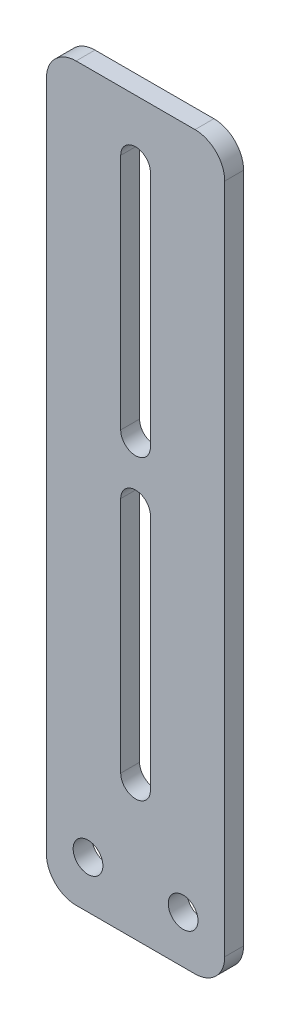
ISO-10303-21;
HEADER;
FILE_DESCRIPTION(('STEP AP214'),'2;1');
FILE_NAME('part.step','',(''),(''),'','','');
FILE_SCHEMA(('AUTOMOTIVE_DESIGN { 1 0 10303 214 1 1 1 1 }'));
ENDSEC;
DATA;
#1=APPLICATION_CONTEXT('core data for automotive mechanical design processes');
#2=APPLICATION_PROTOCOL_DEFINITION('international standard','automotive_design',2000,#1);
#3=PRODUCT_CONTEXT('',#1,'mechanical');
#4=PRODUCT('Part','Part','',(#3));
#5=PRODUCT_RELATED_PRODUCT_CATEGORY('part','',(#4));
#6=PRODUCT_DEFINITION_FORMATION('','',#4);
#7=PRODUCT_DEFINITION_CONTEXT('part definition',#1,'design');
#8=PRODUCT_DEFINITION('design','',#6,#7);
#9=PRODUCT_DEFINITION_SHAPE('','',#8);
#10=(LENGTH_UNIT() NAMED_UNIT(*) SI_UNIT(.MILLI.,.METRE.));
#11=(NAMED_UNIT(*) PLANE_ANGLE_UNIT() SI_UNIT($,.RADIAN.));
#12=(NAMED_UNIT(*) SI_UNIT($,.STERADIAN.) SOLID_ANGLE_UNIT());
#13=UNCERTAINTY_MEASURE_WITH_UNIT(LENGTH_MEASURE(1.E-05),#10,'distance_accuracy_value','');
#14=(GEOMETRIC_REPRESENTATION_CONTEXT(3) GLOBAL_UNCERTAINTY_ASSIGNED_CONTEXT((#13)) GLOBAL_UNIT_ASSIGNED_CONTEXT((#10,
#11,#12)) REPRESENTATION_CONTEXT('',''));
#15=CARTESIAN_POINT('',(0.,0.,0.));
#16=DIRECTION('',(0.,0.,1.));
#17=DIRECTION('',(1.,0.,0.));
#18=AXIS2_PLACEMENT_3D('',#15,#16,#17);
#19=CARTESIAN_POINT('',(0.,0.,3.175));
#20=DIRECTION('',(0.,0.,1.));
#21=DIRECTION('',(1.,0.,0.));
#22=AXIS2_PLACEMENT_3D('',#19,#20,#21);
#23=PLANE('',#22);
#24=CARTESIAN_POINT('',(8.,8.00000000000001,3.175));
#25=DIRECTION('',(0.,0.,1.));
#26=DIRECTION('',(-1.,0.,0.));
#27=AXIS2_PLACEMENT_3D('',#24,#25,#26);
#28=CIRCLE('',#27,2.5);
#29=CARTESIAN_POINT('',(5.5,8.00000000000001,3.175));
#30=VERTEX_POINT('',#29);
#31=EDGE_CURVE('E183',#30,#30,#28,.T.);
#32=ORIENTED_EDGE('',*,*,#31,.F.);
#33=EDGE_LOOP('',(#32));
#34=FACE_BOUND('',#33,.T.);
#35=DIRECTION('',(1.,0.,0.));
#36=VECTOR('',#35,1.);
#37=CARTESIAN_POINT('',(-15.,0.,3.175));
#38=LINE('',#37,#36);
#39=CARTESIAN_POINT('',(-9.99999999999998,0.,3.175));
#40=VERTEX_POINT('',#39);
#41=CARTESIAN_POINT('',(10.,0.,3.175));
#42=VERTEX_POINT('',#41);
#43=EDGE_CURVE('E230',#40,#42,#38,.T.);
#44=ORIENTED_EDGE('',*,*,#43,.T.);
#45=CARTESIAN_POINT('',(10.,5.,3.175));
#46=DIRECTION('',(0.,0.,1.));
#47=DIRECTION('',(1.,0.,0.));
#48=AXIS2_PLACEMENT_3D('',#45,#46,#47);
#49=CIRCLE('',#48,5.);
#50=CARTESIAN_POINT('',(15.,5.,3.175));
#51=VERTEX_POINT('',#50);
#52=EDGE_CURVE('E268',#42,#51,#49,.T.);
#53=ORIENTED_EDGE('',*,*,#52,.T.);
#54=DIRECTION('',(0.,1.,0.));
#55=VECTOR('',#54,1.);
#56=CARTESIAN_POINT('',(15.,0.,3.175));
#57=LINE('',#56,#55);
#58=CARTESIAN_POINT('',(15.,118.,3.175));
#59=VERTEX_POINT('',#58);
#60=EDGE_CURVE('E233',#51,#59,#57,.T.);
#61=ORIENTED_EDGE('',*,*,#60,.T.);
#62=CARTESIAN_POINT('',(10.,118.,3.175));
#63=DIRECTION('',(0.,0.,1.));
#64=DIRECTION('',(1.,0.,0.));
#65=AXIS2_PLACEMENT_3D('',#62,#63,#64);
#66=CIRCLE('',#65,5.);
#67=CARTESIAN_POINT('',(10.,123.,3.175));
#68=VERTEX_POINT('',#67);
#69=EDGE_CURVE('E264',#59,#68,#66,.T.);
#70=ORIENTED_EDGE('',*,*,#69,.T.);
#71=DIRECTION('',(-1.,0.,0.));
#72=VECTOR('',#71,1.);
#73=CARTESIAN_POINT('',(-15.,123.,3.175));
#74=LINE('',#73,#72);
#75=CARTESIAN_POINT('',(-10.,123.,3.175));
#76=VERTEX_POINT('',#75);
#77=EDGE_CURVE('E225',#68,#76,#74,.T.);
#78=ORIENTED_EDGE('',*,*,#77,.T.);
#79=CARTESIAN_POINT('',(-10.,118.,3.175));
#80=DIRECTION('',(0.,0.,1.));
#81=DIRECTION('',(1.,0.,0.));
#82=AXIS2_PLACEMENT_3D('',#79,#80,#81);
#83=CIRCLE('',#82,5.);
#84=CARTESIAN_POINT('',(-15.,118.,3.175));
#85=VERTEX_POINT('',#84);
#86=EDGE_CURVE('E56',#76,#85,#83,.T.);
#87=ORIENTED_EDGE('',*,*,#86,.T.);
#88=DIRECTION('',(0.,-1.,0.));
#89=VECTOR('',#88,1.);
#90=CARTESIAN_POINT('',(-15.,123.,3.175));
#91=LINE('',#90,#89);
#92=CARTESIAN_POINT('',(-15.,5.,3.175));
#93=VERTEX_POINT('',#92);
#94=EDGE_CURVE('E227',#85,#93,#91,.T.);
#95=ORIENTED_EDGE('',*,*,#94,.T.);
#96=CARTESIAN_POINT('',(-9.99999999999998,5.,3.175));
#97=DIRECTION('',(0.,0.,1.));
#98=DIRECTION('',(1.,0.,0.));
#99=AXIS2_PLACEMENT_3D('',#96,#97,#98);
#100=CIRCLE('',#99,5.);
#101=EDGE_CURVE('E266',#93,#40,#100,.T.);
#102=ORIENTED_EDGE('',*,*,#101,.T.);
#103=EDGE_LOOP('',(#44,#53,#61,#70,#78,#87,#95,#102));
#104=FACE_BOUND('',#103,.T.);
#105=DIRECTION('',(0.,-1.,0.));
#106=VECTOR('',#105,1.);
#107=CARTESIAN_POINT('',(-2.50000000000001,113.,3.175));
#108=LINE('',#107,#106);
#109=CARTESIAN_POINT('',(-2.50000000000001,113.,3.175));
#110=VERTEX_POINT('',#109);
#111=CARTESIAN_POINT('',(-2.50000000000002,73.,3.175));
#112=VERTEX_POINT('',#111);
#113=EDGE_CURVE('E196',#110,#112,#108,.T.);
#114=ORIENTED_EDGE('',*,*,#113,.F.);
#115=CARTESIAN_POINT('',(0.,113.,3.175));
#116=DIRECTION('',(0.,0.,1.));
#117=DIRECTION('',(1.,0.,0.));
#118=AXIS2_PLACEMENT_3D('',#115,#116,#117);
#119=CIRCLE('',#118,2.5);
#120=CARTESIAN_POINT('',(2.49999999999999,113.,3.175));
#121=VERTEX_POINT('',#120);
#122=EDGE_CURVE('E194',#121,#110,#119,.T.);
#123=ORIENTED_EDGE('',*,*,#122,.F.);
#124=DIRECTION('',(0.,1.,0.));
#125=VECTOR('',#124,1.);
#126=CARTESIAN_POINT('',(2.49999999999999,113.,3.175));
#127=LINE('',#126,#125);
#128=CARTESIAN_POINT('',(2.49999999999998,73.,3.175));
#129=VERTEX_POINT('',#128);
#130=EDGE_CURVE('E202',#129,#121,#127,.T.);
#131=ORIENTED_EDGE('',*,*,#130,.F.);
#132=CARTESIAN_POINT('',(0.,73.,3.175));
#133=DIRECTION('',(0.,0.,1.));
#134=DIRECTION('',(1.,0.,0.));
#135=AXIS2_PLACEMENT_3D('',#132,#133,#134);
#136=CIRCLE('',#135,2.5);
#137=EDGE_CURVE('E199',#112,#129,#136,.T.);
#138=ORIENTED_EDGE('',*,*,#137,.F.);
#139=EDGE_LOOP('',(#114,#123,#131,#138));
#140=FACE_BOUND('',#139,.T.);
#141=DIRECTION('',(0.,1.,0.));
#142=VECTOR('',#141,1.);
#143=CARTESIAN_POINT('',(2.49999999999998,63.,3.175));
#144=LINE('',#143,#142);
#145=CARTESIAN_POINT('',(2.49999999999998,23.,3.175));
#146=VERTEX_POINT('',#145);
#147=CARTESIAN_POINT('',(2.49999999999998,63.,3.175));
#148=VERTEX_POINT('',#147);
#149=EDGE_CURVE('E160',#146,#148,#144,.T.);
#150=ORIENTED_EDGE('',*,*,#149,.F.);
#151=CARTESIAN_POINT('',(0.,23.,3.175));
#152=DIRECTION('',(0.,0.,1.));
#153=DIRECTION('',(1.,0.,0.));
#154=AXIS2_PLACEMENT_3D('',#151,#152,#153);
#155=CIRCLE('',#154,2.5);
#156=CARTESIAN_POINT('',(-2.50000000000001,23.,3.175));
#157=VERTEX_POINT('',#156);
#158=EDGE_CURVE('E150',#157,#146,#155,.T.);
#159=ORIENTED_EDGE('',*,*,#158,.F.);
#160=DIRECTION('',(0.,-1.,0.));
#161=VECTOR('',#160,1.);
#162=CARTESIAN_POINT('',(-2.50000000000002,63.,3.175));
#163=LINE('',#162,#161);
#164=CARTESIAN_POINT('',(-2.50000000000002,63.,3.175));
#165=VERTEX_POINT('',#164);
#166=EDGE_CURVE('E176',#165,#157,#163,.T.);
#167=ORIENTED_EDGE('',*,*,#166,.F.);
#168=CARTESIAN_POINT('',(0.,63.,3.175));
#169=DIRECTION('',(0.,0.,1.));
#170=DIRECTION('',(-1.,0.,0.));
#171=AXIS2_PLACEMENT_3D('',#168,#169,#170);
#172=CIRCLE('',#171,2.5);
#173=EDGE_CURVE('E174',#148,#165,#172,.T.);
#174=ORIENTED_EDGE('',*,*,#173,.F.);
#175=EDGE_LOOP('',(#150,#159,#167,#174));
#176=FACE_BOUND('',#175,.T.);
#177=CARTESIAN_POINT('',(-8.,8.00000000000001,3.175));
#178=DIRECTION('',(0.,0.,1.));
#179=DIRECTION('',(1.,0.,0.));
#180=AXIS2_PLACEMENT_3D('',#177,#178,#179);
#181=CIRCLE('',#180,2.5);
#182=CARTESIAN_POINT('',(-5.5,8.00000000000001,3.175));
#183=VERTEX_POINT('',#182);
#184=EDGE_CURVE('E506',#183,#183,#181,.T.);
#185=ORIENTED_EDGE('',*,*,#184,.F.);
#186=EDGE_LOOP('',(#185));
#187=FACE_BOUND('',#186,.T.);
#188=ADVANCED_FACE('F34',(#34,#104,#140,#176,#187),#23,.T.);
#189=CARTESIAN_POINT('',(0.,0.,0.));
#190=DIRECTION('',(0.,0.,1.));
#191=DIRECTION('',(1.,0.,0.));
#192=AXIS2_PLACEMENT_3D('',#189,#190,#191);
#193=PLANE('',#192);
#194=CARTESIAN_POINT('',(0.,113.,0.));
#195=DIRECTION('',(0.,0.,1.));
#196=DIRECTION('',(1.,0.,0.));
#197=AXIS2_PLACEMENT_3D('',#194,#195,#196);
#198=CIRCLE('',#197,2.5);
#199=CARTESIAN_POINT('',(2.49999999999999,113.,0.));
#200=VERTEX_POINT('',#199);
#201=CARTESIAN_POINT('',(-2.50000000000001,113.,0.));
#202=VERTEX_POINT('',#201);
#203=EDGE_CURVE('E168',#200,#202,#198,.T.);
#204=ORIENTED_EDGE('',*,*,#203,.T.);
#205=DIRECTION('',(0.,-1.,0.));
#206=VECTOR('',#205,1.);
#207=CARTESIAN_POINT('',(-2.50000000000001,113.,0.));
#208=LINE('',#207,#206);
#209=CARTESIAN_POINT('',(-2.50000000000002,73.,0.));
#210=VERTEX_POINT('',#209);
#211=EDGE_CURVE('E207',#202,#210,#208,.T.);
#212=ORIENTED_EDGE('',*,*,#211,.T.);
#213=CARTESIAN_POINT('',(0.,73.,0.));
#214=DIRECTION('',(0.,0.,1.));
#215=DIRECTION('',(1.,0.,0.));
#216=AXIS2_PLACEMENT_3D('',#213,#214,#215);
#217=CIRCLE('',#216,2.5);
#218=CARTESIAN_POINT('',(2.49999999999998,73.,0.));
#219=VERTEX_POINT('',#218);
#220=EDGE_CURVE('E210',#210,#219,#217,.T.);
#221=ORIENTED_EDGE('',*,*,#220,.T.);
#222=DIRECTION('',(0.,1.,0.));
#223=VECTOR('',#222,1.);
#224=CARTESIAN_POINT('',(2.49999999999999,113.,0.));
#225=LINE('',#224,#223);
#226=EDGE_CURVE('E197',#219,#200,#225,.T.);
#227=ORIENTED_EDGE('',*,*,#226,.T.);
#228=EDGE_LOOP('',(#204,#212,#221,#227));
#229=FACE_BOUND('',#228,.T.);
#230=DIRECTION('',(0.,1.,0.));
#231=VECTOR('',#230,1.);
#232=CARTESIAN_POINT('',(15.,0.,0.));
#233=LINE('',#232,#231);
#234=CARTESIAN_POINT('',(15.,5.,0.));
#235=VERTEX_POINT('',#234);
#236=CARTESIAN_POINT('',(15.,118.,0.));
#237=VERTEX_POINT('',#236);
#238=EDGE_CURVE('E228',#235,#237,#233,.T.);
#239=ORIENTED_EDGE('',*,*,#238,.F.);
#240=CARTESIAN_POINT('',(10.,5.,0.));
#241=DIRECTION('',(0.,0.,1.));
#242=DIRECTION('',(1.,0.,0.));
#243=AXIS2_PLACEMENT_3D('',#240,#241,#242);
#244=CIRCLE('',#243,5.);
#245=CARTESIAN_POINT('',(10.,0.,0.));
#246=VERTEX_POINT('',#245);
#247=EDGE_CURVE('E256',#235,#246,#244,.F.);
#248=ORIENTED_EDGE('',*,*,#247,.T.);
#249=DIRECTION('',(1.,0.,0.));
#250=VECTOR('',#249,1.);
#251=CARTESIAN_POINT('',(-15.,0.,0.));
#252=LINE('',#251,#250);
#253=CARTESIAN_POINT('',(-9.99999999999998,0.,0.));
#254=VERTEX_POINT('',#253);
#255=EDGE_CURVE('E241',#254,#246,#252,.T.);
#256=ORIENTED_EDGE('',*,*,#255,.F.);
#257=CARTESIAN_POINT('',(-9.99999999999998,5.,0.));
#258=DIRECTION('',(0.,0.,1.));
#259=DIRECTION('',(1.,0.,0.));
#260=AXIS2_PLACEMENT_3D('',#257,#258,#259);
#261=CIRCLE('',#260,5.);
#262=CARTESIAN_POINT('',(-15.,5.,0.));
#263=VERTEX_POINT('',#262);
#264=EDGE_CURVE('E254',#254,#263,#261,.F.);
#265=ORIENTED_EDGE('',*,*,#264,.T.);
#266=DIRECTION('',(0.,-1.,0.));
#267=VECTOR('',#266,1.);
#268=CARTESIAN_POINT('',(-15.,123.,0.));
#269=LINE('',#268,#267);
#270=CARTESIAN_POINT('',(-15.,118.,0.));
#271=VERTEX_POINT('',#270);
#272=EDGE_CURVE('E239',#271,#263,#269,.T.);
#273=ORIENTED_EDGE('',*,*,#272,.F.);
#274=CARTESIAN_POINT('',(-10.,118.,0.));
#275=DIRECTION('',(0.,0.,1.));
#276=DIRECTION('',(1.,0.,0.));
#277=AXIS2_PLACEMENT_3D('',#274,#275,#276);
#278=CIRCLE('',#277,5.);
#279=CARTESIAN_POINT('',(-10.,123.,0.));
#280=VERTEX_POINT('',#279);
#281=EDGE_CURVE('E250',#271,#280,#278,.F.);
#282=ORIENTED_EDGE('',*,*,#281,.T.);
#283=DIRECTION('',(-1.,0.,0.));
#284=VECTOR('',#283,1.);
#285=CARTESIAN_POINT('',(-15.,123.,0.));
#286=LINE('',#285,#284);
#287=CARTESIAN_POINT('',(10.,123.,0.));
#288=VERTEX_POINT('',#287);
#289=EDGE_CURVE('E224',#288,#280,#286,.T.);
#290=ORIENTED_EDGE('',*,*,#289,.F.);
#291=CARTESIAN_POINT('',(10.,118.,0.));
#292=DIRECTION('',(0.,0.,1.));
#293=DIRECTION('',(1.,0.,0.));
#294=AXIS2_PLACEMENT_3D('',#291,#292,#293);
#295=CIRCLE('',#294,5.);
#296=EDGE_CURVE('E252',#288,#237,#295,.F.);
#297=ORIENTED_EDGE('',*,*,#296,.T.);
#298=EDGE_LOOP('',(#239,#248,#256,#265,#273,#282,#290,#297));
#299=FACE_BOUND('',#298,.T.);
#300=CARTESIAN_POINT('',(0.,23.,0.));
#301=DIRECTION('',(0.,0.,1.));
#302=DIRECTION('',(1.,0.,0.));
#303=AXIS2_PLACEMENT_3D('',#300,#301,#302);
#304=CIRCLE('',#303,2.5);
#305=CARTESIAN_POINT('',(-2.50000000000001,23.,0.));
#306=VERTEX_POINT('',#305);
#307=CARTESIAN_POINT('',(2.49999999999998,23.,0.));
#308=VERTEX_POINT('',#307);
#309=EDGE_CURVE('E181',#306,#308,#304,.T.);
#310=ORIENTED_EDGE('',*,*,#309,.T.);
#311=DIRECTION('',(0.,1.,0.));
#312=VECTOR('',#311,1.);
#313=CARTESIAN_POINT('',(2.49999999999998,63.,0.));
#314=LINE('',#313,#312);
#315=CARTESIAN_POINT('',(2.49999999999998,63.,0.));
#316=VERTEX_POINT('',#315);
#317=EDGE_CURVE('E167',#308,#316,#314,.T.);
#318=ORIENTED_EDGE('',*,*,#317,.T.);
#319=CARTESIAN_POINT('',(0.,63.,0.));
#320=DIRECTION('',(0.,0.,1.));
#321=DIRECTION('',(-1.,0.,0.));
#322=AXIS2_PLACEMENT_3D('',#319,#320,#321);
#323=CIRCLE('',#322,2.5);
#324=CARTESIAN_POINT('',(-2.50000000000002,63.,0.));
#325=VERTEX_POINT('',#324);
#326=EDGE_CURVE('E185',#316,#325,#323,.T.);
#327=ORIENTED_EDGE('',*,*,#326,.T.);
#328=DIRECTION('',(0.,-1.,0.));
#329=VECTOR('',#328,1.);
#330=CARTESIAN_POINT('',(-2.50000000000002,63.,0.));
#331=LINE('',#330,#329);
#332=EDGE_CURVE('E161',#325,#306,#331,.T.);
#333=ORIENTED_EDGE('',*,*,#332,.T.);
#334=EDGE_LOOP('',(#310,#318,#327,#333));
#335=FACE_BOUND('',#334,.T.);
#336=CARTESIAN_POINT('',(8.,8.00000000000001,0.));
#337=DIRECTION('',(0.,0.,1.));
#338=DIRECTION('',(-1.,0.,0.));
#339=AXIS2_PLACEMENT_3D('',#336,#337,#338);
#340=CIRCLE('',#339,2.5);
#341=CARTESIAN_POINT('',(5.5,8.00000000000001,0.));
#342=VERTEX_POINT('',#341);
#343=EDGE_CURVE('E502',#342,#342,#340,.T.);
#344=ORIENTED_EDGE('',*,*,#343,.T.);
#345=EDGE_LOOP('',(#344));
#346=FACE_BOUND('',#345,.T.);
#347=CARTESIAN_POINT('',(-8.,8.00000000000001,0.));
#348=DIRECTION('',(0.,0.,1.));
#349=DIRECTION('',(1.,0.,0.));
#350=AXIS2_PLACEMENT_3D('',#347,#348,#349);
#351=CIRCLE('',#350,2.5);
#352=CARTESIAN_POINT('',(-5.5,8.00000000000001,0.));
#353=VERTEX_POINT('',#352);
#354=EDGE_CURVE('E505',#353,#353,#351,.T.);
#355=ORIENTED_EDGE('',*,*,#354,.T.);
#356=EDGE_LOOP('',(#355));
#357=FACE_BOUND('',#356,.T.);
#358=ADVANCED_FACE('F287',(#229,#299,#335,#346,#357),#193,.F.);
#359=CARTESIAN_POINT('',(-15.,123.,3.175));
#360=DIRECTION('',(0.,-1.,0.));
#361=DIRECTION('',(0.,0.,-1.));
#362=AXIS2_PLACEMENT_3D('',#359,#360,#361);
#363=PLANE('',#362);
#364=ORIENTED_EDGE('',*,*,#77,.F.);
#365=DIRECTION('',(0.,0.,-1.));
#366=VECTOR('',#365,1.);
#367=CARTESIAN_POINT('',(10.,123.,3.175));
#368=LINE('',#367,#366);
#369=EDGE_CURVE('E11',#68,#288,#368,.T.);
#370=ORIENTED_EDGE('',*,*,#369,.T.);
#371=ORIENTED_EDGE('',*,*,#289,.T.);
#372=DIRECTION('',(0.,0.,-1.));
#373=VECTOR('',#372,1.);
#374=CARTESIAN_POINT('',(-10.,123.,3.175));
#375=LINE('',#374,#373);
#376=EDGE_CURVE('E42',#280,#76,#375,.F.);
#377=ORIENTED_EDGE('',*,*,#376,.T.);
#378=EDGE_LOOP('',(#364,#370,#371,#377));
#379=FACE_BOUND('',#378,.T.);
#380=ADVANCED_FACE('F276',(#379),#363,.F.);
#381=CARTESIAN_POINT('',(-15.,123.,3.175));
#382=DIRECTION('',(1.,0.,0.));
#383=DIRECTION('',(0.,1.,0.));
#384=AXIS2_PLACEMENT_3D('',#381,#382,#383);
#385=PLANE('',#384);
#386=ORIENTED_EDGE('',*,*,#272,.T.);
#387=DIRECTION('',(0.,0.,-1.));
#388=VECTOR('',#387,1.);
#389=CARTESIAN_POINT('',(-15.,5.,3.175));
#390=LINE('',#389,#388);
#391=EDGE_CURVE('E49',#263,#93,#390,.F.);
#392=ORIENTED_EDGE('',*,*,#391,.T.);
#393=ORIENTED_EDGE('',*,*,#94,.F.);
#394=DIRECTION('',(0.,0.,-1.));
#395=VECTOR('',#394,1.);
#396=CARTESIAN_POINT('',(-15.,118.,3.175));
#397=LINE('',#396,#395);
#398=EDGE_CURVE('E270',#85,#271,#397,.T.);
#399=ORIENTED_EDGE('',*,*,#398,.T.);
#400=EDGE_LOOP('',(#386,#392,#393,#399));
#401=FACE_BOUND('',#400,.T.);
#402=ADVANCED_FACE('F284',(#401),#385,.F.);
#403=CARTESIAN_POINT('',(-15.,0.,3.175));
#404=DIRECTION('',(0.,1.,0.));
#405=DIRECTION('',(-1.,0.,0.));
#406=AXIS2_PLACEMENT_3D('',#403,#404,#405);
#407=PLANE('',#406);
#408=ORIENTED_EDGE('',*,*,#255,.T.);
#409=DIRECTION('',(0.,0.,-1.));
#410=VECTOR('',#409,1.);
#411=CARTESIAN_POINT('',(10.,0.,3.175));
#412=LINE('',#411,#410);
#413=EDGE_CURVE('E261',#246,#42,#412,.F.);
#414=ORIENTED_EDGE('',*,*,#413,.T.);
#415=ORIENTED_EDGE('',*,*,#43,.F.);
#416=DIRECTION('',(0.,0.,-1.));
#417=VECTOR('',#416,1.);
#418=CARTESIAN_POINT('',(-9.99999999999998,0.,3.175));
#419=LINE('',#418,#417);
#420=EDGE_CURVE('E258',#40,#254,#419,.T.);
#421=ORIENTED_EDGE('',*,*,#420,.T.);
#422=EDGE_LOOP('',(#408,#414,#415,#421));
#423=FACE_BOUND('',#422,.T.);
#424=ADVANCED_FACE('F296',(#423),#407,.F.);
#425=CARTESIAN_POINT('',(15.,0.,3.175));
#426=DIRECTION('',(-1.,0.,0.));
#427=DIRECTION('',(0.,-1.,0.));
#428=AXIS2_PLACEMENT_3D('',#425,#426,#427);
#429=PLANE('',#428);
#430=ORIENTED_EDGE('',*,*,#60,.F.);
#431=DIRECTION('',(0.,0.,-1.));
#432=VECTOR('',#431,1.);
#433=CARTESIAN_POINT('',(15.,5.,3.175));
#434=LINE('',#433,#432);
#435=EDGE_CURVE('E247',#51,#235,#434,.T.);
#436=ORIENTED_EDGE('',*,*,#435,.T.);
#437=ORIENTED_EDGE('',*,*,#238,.T.);
#438=DIRECTION('',(0.,0.,-1.));
#439=VECTOR('',#438,1.);
#440=CARTESIAN_POINT('',(15.,118.,3.175));
#441=LINE('',#440,#439);
#442=EDGE_CURVE('E236',#237,#59,#441,.F.);
#443=ORIENTED_EDGE('',*,*,#442,.T.);
#444=EDGE_LOOP('',(#430,#436,#437,#443));
#445=FACE_BOUND('',#444,.T.);
#446=ADVANCED_FACE('F304',(#445),#429,.F.);
#447=CARTESIAN_POINT('',(0.,113.,3.175));
#448=DIRECTION('',(0.,0.,-1.));
#449=DIRECTION('',(-1.,0.,0.));
#450=AXIS2_PLACEMENT_3D('',#447,#448,#449);
#451=CYLINDRICAL_SURFACE('',#450,2.5);
#452=ORIENTED_EDGE('',*,*,#203,.F.);
#453=DIRECTION('',(0.,0.,-1.));
#454=VECTOR('',#453,1.);
#455=CARTESIAN_POINT('',(2.49999999999999,113.,3.175));
#456=LINE('',#455,#454);
#457=EDGE_CURVE('E204',#121,#200,#456,.T.);
#458=ORIENTED_EDGE('',*,*,#457,.F.);
#459=ORIENTED_EDGE('',*,*,#122,.T.);
#460=DIRECTION('',(0.,0.,-1.));
#461=VECTOR('',#460,1.);
#462=CARTESIAN_POINT('',(-2.50000000000001,113.,3.175));
#463=LINE('',#462,#461);
#464=EDGE_CURVE('E221',#110,#202,#463,.T.);
#465=ORIENTED_EDGE('',*,*,#464,.T.);
#466=EDGE_LOOP('',(#452,#458,#459,#465));
#467=FACE_BOUND('',#466,.T.);
#468=ADVANCED_FACE('F324',(#467),#451,.F.);
#469=CARTESIAN_POINT('',(-2.50000000000001,113.,3.175));
#470=DIRECTION('',(1.,0.,0.));
#471=DIRECTION('',(0.,1.,0.));
#472=AXIS2_PLACEMENT_3D('',#469,#470,#471);
#473=PLANE('',#472);
#474=ORIENTED_EDGE('',*,*,#211,.F.);
#475=ORIENTED_EDGE('',*,*,#464,.F.);
#476=ORIENTED_EDGE('',*,*,#113,.T.);
#477=DIRECTION('',(0.,0.,-1.));
#478=VECTOR('',#477,1.);
#479=CARTESIAN_POINT('',(-2.50000000000002,73.,3.175));
#480=LINE('',#479,#478);
#481=EDGE_CURVE('E219',#112,#210,#480,.T.);
#482=ORIENTED_EDGE('',*,*,#481,.T.);
#483=EDGE_LOOP('',(#474,#475,#476,#482));
#484=FACE_BOUND('',#483,.T.);
#485=ADVANCED_FACE('F369',(#484),#473,.T.);
#486=CARTESIAN_POINT('',(0.,73.,3.175));
#487=DIRECTION('',(0.,0.,-1.));
#488=DIRECTION('',(-1.,0.,0.));
#489=AXIS2_PLACEMENT_3D('',#486,#487,#488);
#490=CYLINDRICAL_SURFACE('',#489,2.5);
#491=ORIENTED_EDGE('',*,*,#220,.F.);
#492=ORIENTED_EDGE('',*,*,#481,.F.);
#493=ORIENTED_EDGE('',*,*,#137,.T.);
#494=DIRECTION('',(0.,0.,-1.));
#495=VECTOR('',#494,1.);
#496=CARTESIAN_POINT('',(2.49999999999998,73.,3.175));
#497=LINE('',#496,#495);
#498=EDGE_CURVE('E217',#129,#219,#497,.T.);
#499=ORIENTED_EDGE('',*,*,#498,.T.);
#500=EDGE_LOOP('',(#491,#492,#493,#499));
#501=FACE_BOUND('',#500,.T.);
#502=ADVANCED_FACE('F366',(#501),#490,.F.);
#503=CARTESIAN_POINT('',(2.49999999999999,113.,3.175));
#504=DIRECTION('',(-1.,0.,0.));
#505=DIRECTION('',(0.,-1.,0.));
#506=AXIS2_PLACEMENT_3D('',#503,#504,#505);
#507=PLANE('',#506);
#508=ORIENTED_EDGE('',*,*,#226,.F.);
#509=ORIENTED_EDGE('',*,*,#498,.F.);
#510=ORIENTED_EDGE('',*,*,#130,.T.);
#511=ORIENTED_EDGE('',*,*,#457,.T.);
#512=EDGE_LOOP('',(#508,#509,#510,#511));
#513=FACE_BOUND('',#512,.T.);
#514=ADVANCED_FACE('F363',(#513),#507,.T.);
#515=CARTESIAN_POINT('',(0.,23.,3.175));
#516=DIRECTION('',(0.,0.,-1.));
#517=DIRECTION('',(-1.,0.,0.));
#518=AXIS2_PLACEMENT_3D('',#515,#516,#517);
#519=CYLINDRICAL_SURFACE('',#518,2.5);
#520=ORIENTED_EDGE('',*,*,#309,.F.);
#521=DIRECTION('',(0.,0.,-1.));
#522=VECTOR('',#521,1.);
#523=CARTESIAN_POINT('',(-2.50000000000001,23.,3.175));
#524=LINE('',#523,#522);
#525=EDGE_CURVE('E156',#157,#306,#524,.T.);
#526=ORIENTED_EDGE('',*,*,#525,.F.);
#527=ORIENTED_EDGE('',*,*,#158,.T.);
#528=DIRECTION('',(0.,0.,-1.));
#529=VECTOR('',#528,1.);
#530=CARTESIAN_POINT('',(2.49999999999998,23.,3.175));
#531=LINE('',#530,#529);
#532=EDGE_CURVE('E153',#146,#308,#531,.T.);
#533=ORIENTED_EDGE('',*,*,#532,.T.);
#534=EDGE_LOOP('',(#520,#526,#527,#533));
#535=FACE_BOUND('',#534,.T.);
#536=ADVANCED_FACE('F152',(#535),#519,.F.);
#537=CARTESIAN_POINT('',(2.49999999999998,63.,3.175));
#538=DIRECTION('',(-1.,0.,0.));
#539=DIRECTION('',(0.,-1.,0.));
#540=AXIS2_PLACEMENT_3D('',#537,#538,#539);
#541=PLANE('',#540);
#542=ORIENTED_EDGE('',*,*,#317,.F.);
#543=ORIENTED_EDGE('',*,*,#532,.F.);
#544=ORIENTED_EDGE('',*,*,#149,.T.);
#545=DIRECTION('',(0.,0.,-1.));
#546=VECTOR('',#545,1.);
#547=CARTESIAN_POINT('',(2.49999999999998,63.,3.175));
#548=LINE('',#547,#546);
#549=EDGE_CURVE('E169',#148,#316,#548,.T.);
#550=ORIENTED_EDGE('',*,*,#549,.T.);
#551=EDGE_LOOP('',(#542,#543,#544,#550));
#552=FACE_BOUND('',#551,.T.);
#553=ADVANCED_FACE('F164',(#552),#541,.T.);
#554=CARTESIAN_POINT('',(0.,63.,3.175));
#555=DIRECTION('',(0.,0.,-1.));
#556=DIRECTION('',(-1.,0.,0.));
#557=AXIS2_PLACEMENT_3D('',#554,#555,#556);
#558=CYLINDRICAL_SURFACE('',#557,2.5);
#559=ORIENTED_EDGE('',*,*,#326,.F.);
#560=ORIENTED_EDGE('',*,*,#549,.F.);
#561=ORIENTED_EDGE('',*,*,#173,.T.);
#562=DIRECTION('',(0.,0.,-1.));
#563=VECTOR('',#562,1.);
#564=CARTESIAN_POINT('',(-2.50000000000002,63.,3.175));
#565=LINE('',#564,#563);
#566=EDGE_CURVE('E191',#165,#325,#565,.T.);
#567=ORIENTED_EDGE('',*,*,#566,.T.);
#568=EDGE_LOOP('',(#559,#560,#561,#567));
#569=FACE_BOUND('',#568,.T.);
#570=ADVANCED_FACE('F354',(#569),#558,.F.);
#571=CARTESIAN_POINT('',(-2.50000000000002,63.,3.175));
#572=DIRECTION('',(1.,0.,0.));
#573=DIRECTION('',(0.,1.,0.));
#574=AXIS2_PLACEMENT_3D('',#571,#572,#573);
#575=PLANE('',#574);
#576=ORIENTED_EDGE('',*,*,#332,.F.);
#577=ORIENTED_EDGE('',*,*,#566,.F.);
#578=ORIENTED_EDGE('',*,*,#166,.T.);
#579=ORIENTED_EDGE('',*,*,#525,.T.);
#580=EDGE_LOOP('',(#576,#577,#578,#579));
#581=FACE_BOUND('',#580,.T.);
#582=ADVANCED_FACE('F346',(#581),#575,.T.);
#583=CARTESIAN_POINT('',(8.,8.00000000000001,3.175));
#584=DIRECTION('',(0.,0.,-1.));
#585=DIRECTION('',(-1.,0.,0.));
#586=AXIS2_PLACEMENT_3D('',#583,#584,#585);
#587=CYLINDRICAL_SURFACE('',#586,2.5);
#588=ORIENTED_EDGE('',*,*,#31,.T.);
#589=EDGE_LOOP('',(#588));
#590=FACE_BOUND('',#589,.T.);
#591=ORIENTED_EDGE('',*,*,#343,.F.);
#592=EDGE_LOOP('',(#591));
#593=FACE_BOUND('',#592,.T.);
#594=ADVANCED_FACE('F340',(#590,#593),#587,.F.);
#595=CARTESIAN_POINT('',(-8.,8.00000000000001,3.175));
#596=DIRECTION('',(0.,0.,-1.));
#597=DIRECTION('',(-1.,0.,0.));
#598=AXIS2_PLACEMENT_3D('',#595,#596,#597);
#599=CYLINDRICAL_SURFACE('',#598,2.5);
#600=ORIENTED_EDGE('',*,*,#184,.T.);
#601=EDGE_LOOP('',(#600));
#602=FACE_BOUND('',#601,.T.);
#603=ORIENTED_EDGE('',*,*,#354,.F.);
#604=EDGE_LOOP('',(#603));
#605=FACE_BOUND('',#604,.T.);
#606=ADVANCED_FACE('F336',(#602,#605),#599,.F.);
#607=CARTESIAN_POINT('',(10.,5.,3.175));
#608=DIRECTION('',(0.,0.,-1.));
#609=DIRECTION('',(-1.,0.,0.));
#610=AXIS2_PLACEMENT_3D('',#607,#608,#609);
#611=CYLINDRICAL_SURFACE('',#610,5.);
#612=ORIENTED_EDGE('',*,*,#52,.F.);
#613=ORIENTED_EDGE('',*,*,#413,.F.);
#614=ORIENTED_EDGE('',*,*,#247,.F.);
#615=ORIENTED_EDGE('',*,*,#435,.F.);
#616=EDGE_LOOP('',(#612,#613,#614,#615));
#617=FACE_BOUND('',#616,.T.);
#618=ADVANCED_FACE('F302',(#617),#611,.T.);
#619=CARTESIAN_POINT('',(-9.99999999999998,5.,3.175));
#620=DIRECTION('',(0.,0.,-1.));
#621=DIRECTION('',(-1.,0.,0.));
#622=AXIS2_PLACEMENT_3D('',#619,#620,#621);
#623=CYLINDRICAL_SURFACE('',#622,5.);
#624=ORIENTED_EDGE('',*,*,#101,.F.);
#625=ORIENTED_EDGE('',*,*,#391,.F.);
#626=ORIENTED_EDGE('',*,*,#264,.F.);
#627=ORIENTED_EDGE('',*,*,#420,.F.);
#628=EDGE_LOOP('',(#624,#625,#626,#627));
#629=FACE_BOUND('',#628,.T.);
#630=ADVANCED_FACE('F293',(#629),#623,.T.);
#631=CARTESIAN_POINT('',(10.,118.,3.175));
#632=DIRECTION('',(0.,0.,-1.));
#633=DIRECTION('',(-1.,0.,0.));
#634=AXIS2_PLACEMENT_3D('',#631,#632,#633);
#635=CYLINDRICAL_SURFACE('',#634,5.);
#636=ORIENTED_EDGE('',*,*,#69,.F.);
#637=ORIENTED_EDGE('',*,*,#442,.F.);
#638=ORIENTED_EDGE('',*,*,#296,.F.);
#639=ORIENTED_EDGE('',*,*,#369,.F.);
#640=EDGE_LOOP('',(#636,#637,#638,#639));
#641=FACE_BOUND('',#640,.T.);
#642=ADVANCED_FACE('F307',(#641),#635,.T.);
#643=CARTESIAN_POINT('',(-10.,118.,3.175));
#644=DIRECTION('',(0.,0.,-1.));
#645=DIRECTION('',(-1.,0.,0.));
#646=AXIS2_PLACEMENT_3D('',#643,#644,#645);
#647=CYLINDRICAL_SURFACE('',#646,5.);
#648=ORIENTED_EDGE('',*,*,#86,.F.);
#649=ORIENTED_EDGE('',*,*,#376,.F.);
#650=ORIENTED_EDGE('',*,*,#281,.F.);
#651=ORIENTED_EDGE('',*,*,#398,.F.);
#652=EDGE_LOOP('',(#648,#649,#650,#651));
#653=FACE_BOUND('',#652,.T.);
#654=ADVANCED_FACE('F36',(#653),#647,.T.);
#655=CLOSED_SHELL('',(#188,#358,#380,#402,#424,#446,#468,#485,#502,#514,#536,#553,#570,#582,
#594,#606,#618,#630,#642,#654));
#656=MANIFOLD_SOLID_BREP('B2',#655);
#657=ADVANCED_BREP_SHAPE_REPRESENTATION('',(#18,#656),#14);
#658=SHAPE_DEFINITION_REPRESENTATION(#9,#657);
ENDSEC;
END-ISO-10303-21;
